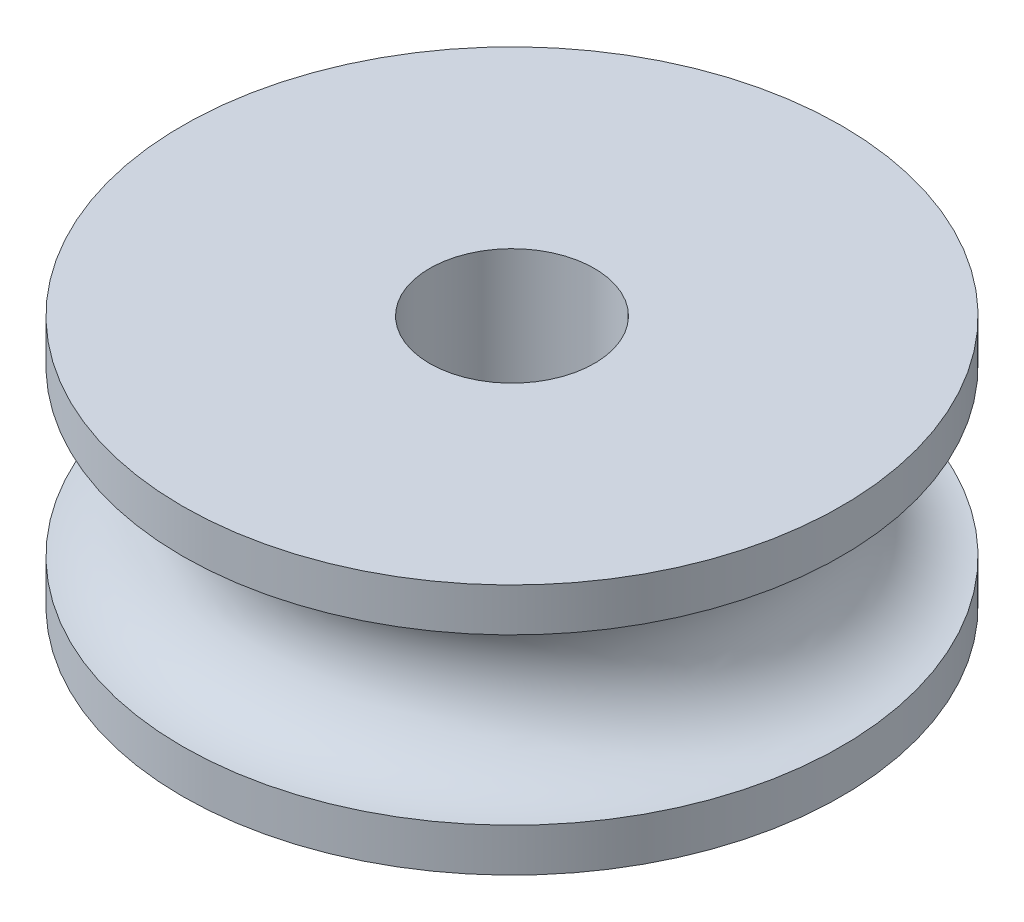
ISO-10303-21;
HEADER;
FILE_DESCRIPTION(('STEP AP214'),'2;1');
FILE_NAME('part.step','',(''),(''),'','','');
FILE_SCHEMA(('AUTOMOTIVE_DESIGN { 1 0 10303 214 1 1 1 1 }'));
ENDSEC;
DATA;
#1=APPLICATION_CONTEXT('core data for automotive mechanical design processes');
#2=APPLICATION_PROTOCOL_DEFINITION('international standard','automotive_design',2000,#1);
#3=PRODUCT_CONTEXT('',#1,'mechanical');
#4=PRODUCT('Part','Part','',(#3));
#5=PRODUCT_RELATED_PRODUCT_CATEGORY('part','',(#4));
#6=PRODUCT_DEFINITION_FORMATION('','',#4);
#7=PRODUCT_DEFINITION_CONTEXT('part definition',#1,'design');
#8=PRODUCT_DEFINITION('design','',#6,#7);
#9=PRODUCT_DEFINITION_SHAPE('','',#8);
#10=(LENGTH_UNIT() NAMED_UNIT(*) SI_UNIT(.MILLI.,.METRE.));
#11=(NAMED_UNIT(*) PLANE_ANGLE_UNIT() SI_UNIT($,.RADIAN.));
#12=(NAMED_UNIT(*) SI_UNIT($,.STERADIAN.) SOLID_ANGLE_UNIT());
#13=UNCERTAINTY_MEASURE_WITH_UNIT(LENGTH_MEASURE(1.E-05),#10,'distance_accuracy_value','');
#14=(GEOMETRIC_REPRESENTATION_CONTEXT(3) GLOBAL_UNCERTAINTY_ASSIGNED_CONTEXT((#13)) GLOBAL_UNIT_ASSIGNED_CONTEXT((#10,
#11,#12)) REPRESENTATION_CONTEXT('',''));
#15=CARTESIAN_POINT('',(0.,0.,0.));
#16=DIRECTION('',(0.,0.,1.));
#17=DIRECTION('',(1.,0.,0.));
#18=AXIS2_PLACEMENT_3D('',#15,#16,#17);
#19=CARTESIAN_POINT('',(0.,62.4335880712998,0.));
#20=DIRECTION('',(0.,1.,0.));
#21=DIRECTION('',(0.,0.,1.));
#22=AXIS2_PLACEMENT_3D('',#19,#20,#21);
#23=CYLINDRICAL_SURFACE('',#22,38.1);
#24=CARTESIAN_POINT('',(0.,9.52499999999999,0.));
#25=DIRECTION('',(0.,1.,0.));
#26=DIRECTION('',(0.,0.,1.));
#27=AXIS2_PLACEMENT_3D('',#24,#25,#26);
#28=CIRCLE('',#27,38.1);
#29=CARTESIAN_POINT('',(0.,9.52499999999999,38.1));
#30=VERTEX_POINT('',#29);
#31=EDGE_CURVE('E10',#30,#30,#28,.T.);
#32=ORIENTED_EDGE('',*,*,#31,.T.);
#33=EDGE_LOOP('',(#32));
#34=FACE_BOUND('',#33,.T.);
#35=CARTESIAN_POINT('',(0.,14.525,0.));
#36=DIRECTION('',(0.,1.,0.));
#37=DIRECTION('',(0.,0.,1.));
#38=AXIS2_PLACEMENT_3D('',#35,#36,#37);
#39=CIRCLE('',#38,38.1);
#40=CARTESIAN_POINT('',(0.,14.525,38.1));
#41=VERTEX_POINT('',#40);
#42=EDGE_CURVE('E56',#41,#41,#39,.T.);
#43=ORIENTED_EDGE('',*,*,#42,.F.);
#44=EDGE_LOOP('',(#43));
#45=FACE_BOUND('',#44,.T.);
#46=ADVANCED_FACE('F39',(#34,#45),#23,.T.);
#47=CARTESIAN_POINT('',(0.,0.,0.));
#48=DIRECTION('',(0.,1.,0.));
#49=DIRECTION('',(0.,0.,1.));
#50=AXIS2_PLACEMENT_3D('',#47,#48,#49);
#51=TOROIDAL_SURFACE('',#50,38.1,9.525);
#52=CARTESIAN_POINT('',(0.,-9.52499999999999,0.));
#53=DIRECTION('',(0.,1.,0.));
#54=DIRECTION('',(0.,0.,1.));
#55=AXIS2_PLACEMENT_3D('',#52,#53,#54);
#56=CIRCLE('',#55,38.1);
#57=CARTESIAN_POINT('',(0.,-9.52499999999999,38.1));
#58=VERTEX_POINT('',#57);
#59=EDGE_CURVE('E46',#58,#58,#56,.T.);
#60=ORIENTED_EDGE('',*,*,#59,.T.);
#61=EDGE_LOOP('',(#60));
#62=FACE_BOUND('',#61,.T.);
#63=ORIENTED_EDGE('',*,*,#31,.F.);
#64=EDGE_LOOP('',(#63));
#65=FACE_BOUND('',#64,.T.);
#66=ADVANCED_FACE('F82',(#62,#65),#51,.F.);
#67=CARTESIAN_POINT('',(0.,62.4335880712998,0.));
#68=DIRECTION('',(0.,1.,0.));
#69=DIRECTION('',(0.,0.,1.));
#70=AXIS2_PLACEMENT_3D('',#67,#68,#69);
#71=CYLINDRICAL_SURFACE('',#70,38.1);
#72=ORIENTED_EDGE('',*,*,#59,.F.);
#73=EDGE_LOOP('',(#72));
#74=FACE_BOUND('',#73,.T.);
#75=CARTESIAN_POINT('',(0.,-14.525,0.));
#76=DIRECTION('',(0.,1.,0.));
#77=DIRECTION('',(0.,0.,1.));
#78=AXIS2_PLACEMENT_3D('',#75,#76,#77);
#79=CIRCLE('',#78,38.1);
#80=CARTESIAN_POINT('',(0.,-14.525,38.1));
#81=VERTEX_POINT('',#80);
#82=EDGE_CURVE('E51',#81,#81,#79,.T.);
#83=ORIENTED_EDGE('',*,*,#82,.T.);
#84=EDGE_LOOP('',(#83));
#85=FACE_BOUND('',#84,.T.);
#86=ADVANCED_FACE('F86',(#74,#85),#71,.T.);
#87=CARTESIAN_POINT('',(0.,-14.525,0.));
#88=DIRECTION('',(0.,1.,0.));
#89=DIRECTION('',(0.,0.,1.));
#90=AXIS2_PLACEMENT_3D('',#87,#88,#89);
#91=PLANE('',#90);
#92=CARTESIAN_POINT('',(0.,-14.525,0.));
#93=DIRECTION('',(0.,1.,0.));
#94=DIRECTION('',(0.,0.,1.));
#95=AXIS2_PLACEMENT_3D('',#92,#93,#94);
#96=CIRCLE('',#95,9.525);
#97=CARTESIAN_POINT('',(0.,-14.525,9.525));
#98=VERTEX_POINT('',#97);
#99=EDGE_CURVE('E62',#98,#98,#96,.T.);
#100=ORIENTED_EDGE('',*,*,#99,.T.);
#101=EDGE_LOOP('',(#100));
#102=FACE_BOUND('',#101,.T.);
#103=ORIENTED_EDGE('',*,*,#82,.F.);
#104=EDGE_LOOP('',(#103));
#105=FACE_BOUND('',#104,.T.);
#106=ADVANCED_FACE('F77',(#102,#105),#91,.F.);
#107=CARTESIAN_POINT('',(0.,14.525,0.));
#108=DIRECTION('',(0.,1.,0.));
#109=DIRECTION('',(0.,0.,1.));
#110=AXIS2_PLACEMENT_3D('',#107,#108,#109);
#111=PLANE('',#110);
#112=CARTESIAN_POINT('',(0.,14.525,0.));
#113=DIRECTION('',(0.,1.,0.));
#114=DIRECTION('',(0.,0.,1.));
#115=AXIS2_PLACEMENT_3D('',#112,#113,#114);
#116=CIRCLE('',#115,9.525);
#117=CARTESIAN_POINT('',(0.,14.525,9.525));
#118=VERTEX_POINT('',#117);
#119=EDGE_CURVE('E66',#118,#118,#116,.T.);
#120=ORIENTED_EDGE('',*,*,#119,.F.);
#121=EDGE_LOOP('',(#120));
#122=FACE_BOUND('',#121,.T.);
#123=ORIENTED_EDGE('',*,*,#42,.T.);
#124=EDGE_LOOP('',(#123));
#125=FACE_BOUND('',#124,.T.);
#126=ADVANCED_FACE('F74',(#122,#125),#111,.T.);
#127=CARTESIAN_POINT('',(0.,-25.475,0.));
#128=DIRECTION('',(0.,1.,0.));
#129=DIRECTION('',(0.,0.,1.));
#130=AXIS2_PLACEMENT_3D('',#127,#128,#129);
#131=CYLINDRICAL_SURFACE('',#130,9.525);
#132=ORIENTED_EDGE('',*,*,#119,.T.);
#133=EDGE_LOOP('',(#132));
#134=FACE_BOUND('',#133,.T.);
#135=ORIENTED_EDGE('',*,*,#99,.F.);
#136=EDGE_LOOP('',(#135));
#137=FACE_BOUND('',#136,.T.);
#138=ADVANCED_FACE('F71',(#134,#137),#131,.F.);
#139=CLOSED_SHELL('',(#46,#66,#86,#106,#126,#138));
#140=MANIFOLD_SOLID_BREP('B2',#139);
#141=ADVANCED_BREP_SHAPE_REPRESENTATION('',(#18,#140),#14);
#142=SHAPE_DEFINITION_REPRESENTATION(#9,#141);
ENDSEC;
END-ISO-10303-21;
